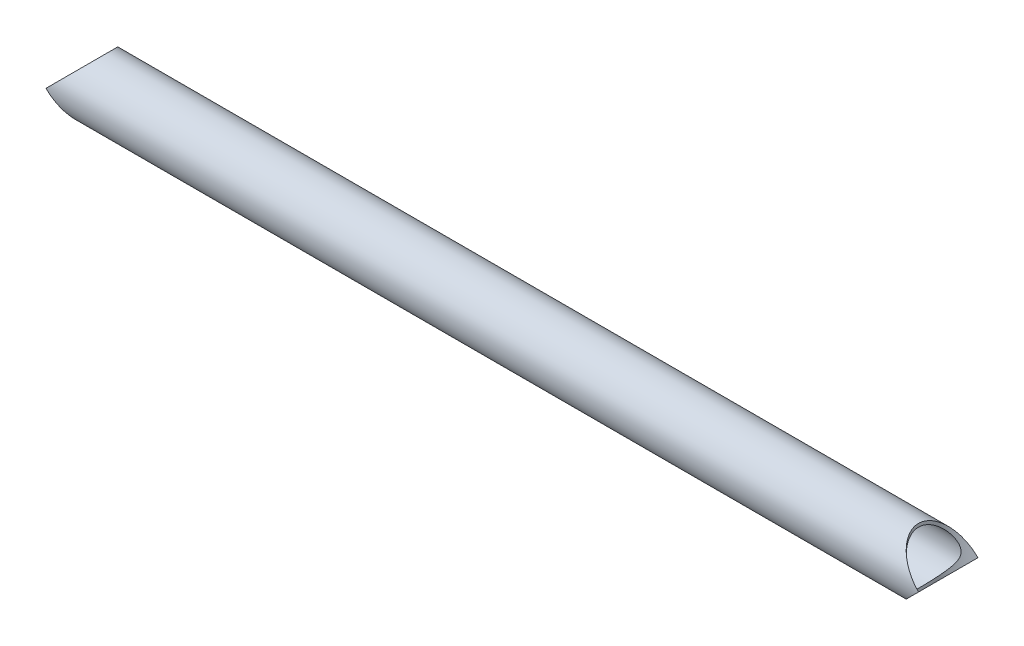
ISO-10303-21;
HEADER;
FILE_DESCRIPTION(('STEP AP214'),'2;1');
FILE_NAME('part.step','',(''),(''),'','','');
FILE_SCHEMA(('AUTOMOTIVE_DESIGN { 1 0 10303 214 1 1 1 1 }'));
ENDSEC;
DATA;
#1=APPLICATION_CONTEXT('core data for automotive mechanical design processes');
#2=APPLICATION_PROTOCOL_DEFINITION('international standard','automotive_design',2000,#1);
#3=PRODUCT_CONTEXT('',#1,'mechanical');
#4=PRODUCT('Part','Part','',(#3));
#5=PRODUCT_RELATED_PRODUCT_CATEGORY('part','',(#4));
#6=PRODUCT_DEFINITION_FORMATION('','',#4);
#7=PRODUCT_DEFINITION_CONTEXT('part definition',#1,'design');
#8=PRODUCT_DEFINITION('design','',#6,#7);
#9=PRODUCT_DEFINITION_SHAPE('','',#8);
#10=(LENGTH_UNIT() NAMED_UNIT(*) SI_UNIT(.MILLI.,.METRE.));
#11=(NAMED_UNIT(*) PLANE_ANGLE_UNIT() SI_UNIT($,.RADIAN.));
#12=(NAMED_UNIT(*) SI_UNIT($,.STERADIAN.) SOLID_ANGLE_UNIT());
#13=UNCERTAINTY_MEASURE_WITH_UNIT(LENGTH_MEASURE(1.E-05),#10,'distance_accuracy_value','');
#14=(GEOMETRIC_REPRESENTATION_CONTEXT(3) GLOBAL_UNCERTAINTY_ASSIGNED_CONTEXT((#13)) GLOBAL_UNIT_ASSIGNED_CONTEXT((#10,
#11,#12)) REPRESENTATION_CONTEXT('',''));
#15=CARTESIAN_POINT('',(0.,0.,0.));
#16=DIRECTION('',(0.,0.,1.));
#17=DIRECTION('',(1.,0.,0.));
#18=AXIS2_PLACEMENT_3D('',#15,#16,#17);
#19=CARTESIAN_POINT('',(-279.4,0.,0.));
#20=DIRECTION('',(1.,0.,0.));
#21=DIRECTION('',(0.,0.,-1.));
#22=AXIS2_PLACEMENT_3D('',#19,#20,#21);
#23=CYLINDRICAL_SURFACE('',#22,16.9418);
#24=CARTESIAN_POINT('',(260.35,16.9418,0.));
#25=CARTESIAN_POINT('',(260.35000374405,16.9417961923884,0.394184193497354));
#26=CARTESIAN_POINT('',(260.362262153139,16.9280155894072,0.788435535775757));
#27=CARTESIAN_POINT('',(260.411024211929,16.8731574498692,1.57356577010718));
#28=CARTESIAN_POINT('',(260.447533436322,16.8320736369451,1.96444386579684));
#29=CARTESIAN_POINT('',(260.544014592432,16.7233639167852,2.73991152674503));
#30=CARTESIAN_POINT('',(260.604008108813,16.6557135918004,3.12449496676739));
#31=CARTESIAN_POINT('',(260.746166269736,16.4951203047581,3.88411123711812));
#32=CARTESIAN_POINT('',(260.828330169879,16.4021781919052,4.25914438764759));
#33=CARTESIAN_POINT('',(261.012598152288,16.1932406328883,4.99488319536369));
#34=CARTESIAN_POINT('',(261.114569298355,16.0773987911132,5.35566607021391));
#35=CARTESIAN_POINT('',(261.33697357334,15.8239912188579,6.06360117385423));
#36=CARTESIAN_POINT('',(261.457406460062,15.6864257733653,6.41075358138511));
#37=CARTESIAN_POINT('',(261.714834278465,15.3913086823074,7.09008972801091));
#38=CARTESIAN_POINT('',(261.851830369669,15.2337556374548,7.42227241690055));
#39=CARTESIAN_POINT('',(262.140464241844,14.900356318422,8.07074683742287));
#40=CARTESIAN_POINT('',(262.292105284975,14.7245059678419,8.38703500458891));
#41=CARTESIAN_POINT('',(262.670217204701,14.2837373054012,9.12410505100004));
#42=CARTESIAN_POINT('',(262.902687093087,14.0109622384892,9.53714057189234));
#43=CARTESIAN_POINT('',(263.387460743635,13.4367851491423,10.3304086586787));
#44=CARTESIAN_POINT('',(263.639771716018,13.1353727115659,10.7106291933897));
#45=CARTESIAN_POINT('',(264.160097116028,12.5063214936942,11.4389050770027));
#46=CARTESIAN_POINT('',(264.428144951756,12.1786263348985,11.7868876327892));
#47=CARTESIAN_POINT('',(264.974845762738,11.499897771744,12.4499819069018));
#48=CARTESIAN_POINT('',(265.253497327648,11.1488674664611,12.7650979759111));
#49=CARTESIAN_POINT('',(265.823194169387,10.4166191913228,13.3697111612045));
#50=CARTESIAN_POINT('',(266.114377220476,10.034898304148,13.6584684285955));
#51=CARTESIAN_POINT('',(266.697673625015,9.24882151979437,14.2025527079429));
#52=CARTESIAN_POINT('',(266.989787225436,8.84445904128633,14.4578699269681));
#53=CARTESIAN_POINT('',(267.567840094133,8.01320927376596,14.9346013590283));
#54=CARTESIAN_POINT('',(267.853789755916,7.58636490171244,15.1560772296062));
#55=CARTESIAN_POINT('',(268.271695004004,6.92746866843015,15.4626419512512));
#56=CARTESIAN_POINT('',(268.409134561576,6.70477675080935,15.5605388024915));
#57=CARTESIAN_POINT('',(268.678904063937,6.25275448249375,15.7476188132693));
#58=CARTESIAN_POINT('',(268.811234784508,6.02342514902508,15.8368032989616));
#59=CARTESIAN_POINT('',(269.070396494113,5.5552838813426,16.0070634993151));
#60=CARTESIAN_POINT('',(269.197156460578,5.31639841182006,16.088045825461));
#61=CARTESIAN_POINT('',(269.441456023067,4.83100990439236,16.2404006796485));
#62=CARTESIAN_POINT('',(269.558997959897,4.58450882268691,16.3117756506805));
#63=CARTESIAN_POINT('',(269.782080889626,4.0837067582187,16.4442984069774));
#64=CARTESIAN_POINT('',(269.887633328698,3.82941351414151,16.5054559733479));
#65=CARTESIAN_POINT('',(270.083627012263,3.31270004661861,16.6168712827558));
#66=CARTESIAN_POINT('',(270.174070755538,3.05028117557337,16.6671308285956));
#67=CARTESIAN_POINT('',(270.322853996104,2.56155126793314,16.7485490492217));
#68=CARTESIAN_POINT('',(270.384027358225,2.33640475862086,16.7814899418482));
#69=CARTESIAN_POINT('',(270.491080238411,1.8814284085682,16.8385670532647));
#70=CARTESIAN_POINT('',(270.536964442065,1.65160002561208,16.8627059697651));
#71=CARTESIAN_POINT('',(270.61142642816,1.18876159210726,16.9016346143041));
#72=CARTESIAN_POINT('',(270.640035117052,0.955757990655739,16.9164410405595));
#73=CARTESIAN_POINT('',(270.678675593239,0.487787683136439,16.9363952490215));
#74=CARTESIAN_POINT('',(270.688708023371,0.252821045282712,16.9415433654564));
#75=CARTESIAN_POINT('',(270.689671046546,-0.217818078177454,16.9420385610885));
#76=CARTESIAN_POINT('',(270.680548328064,-0.453490706010506,16.9373582864601));
#77=CARTESIAN_POINT('',(270.643575971063,-0.922946866189646,16.9182729817827));
#78=CARTESIAN_POINT('',(270.615725790753,-1.15673034368407,16.9038676703857));
#79=CARTESIAN_POINT('',(270.54261073801,-1.62115360877379,16.8656705247631));
#80=CARTESIAN_POINT('',(270.497316267991,-1.85178735983582,16.8418627356726));
#81=CARTESIAN_POINT('',(270.391268999413,-2.30839613187293,16.7853765549414));
#82=CARTESIAN_POINT('',(270.330510348983,-2.53436935416419,16.7526948049513));
#83=CARTESIAN_POINT('',(270.161317887817,-3.09495879054535,16.6602122327194));
#84=CARTESIAN_POINT('',(270.044381527947,-3.42613532293252,16.5950848859265));
#85=CARTESIAN_POINT('',(269.787584269334,-4.07550920863544,16.4476704242981));
#86=CARTESIAN_POINT('',(269.647709104086,-4.39369832980277,16.3653726217851));
#87=CARTESIAN_POINT('',(269.350719694187,-5.01855813637689,16.1847084588516));
#88=CARTESIAN_POINT('',(269.193546861256,-5.3251846390518,16.0862869000012));
#89=CARTESIAN_POINT('',(268.867258231689,-5.92659541327603,15.8745609394275));
#90=CARTESIAN_POINT('',(268.698143533768,-6.22138077036855,15.7612579060561));
#91=CARTESIAN_POINT('',(268.373468669035,-6.76368935777242,15.5355128442468));
#92=CARTESIAN_POINT('',(268.218874817248,-7.01249751499675,15.4247509464399));
#93=CARTESIAN_POINT('',(267.905349492994,-7.50229328838962,15.1925513006733));
#94=CARTESIAN_POINT('',(267.746417447248,-7.74327986165941,15.0711121369911));
#95=CARTESIAN_POINT('',(267.265443368151,-8.45533714282097,14.6908757746472));
#96=CARTESIAN_POINT('',(266.939334858791,-8.91532399132135,14.4162357153203));
#97=CARTESIAN_POINT('',(266.286691494802,-9.80676129687197,13.8252563067096));
#98=CARTESIAN_POINT('',(265.960156916591,-10.2382252174247,13.508936845222));
#99=CARTESIAN_POINT('',(265.31432323517,-11.0723963580602,12.8341031687215));
#100=CARTESIAN_POINT('',(264.995021008555,-11.4751161598644,12.4756075990565));
#101=CARTESIAN_POINT('',(264.429484484933,-12.1767333021638,11.7875104078084));
#102=CARTESIAN_POINT('',(264.180835679443,-12.4808781654303,11.4652302076634));
#103=CARTESIAN_POINT('',(263.696387585142,-13.0672425088248,10.7921703362535));
#104=CARTESIAN_POINT('',(263.460588584201,-13.3494614978141,10.4413900269469));
#105=CARTESIAN_POINT('',(263.005918358068,-13.8891714046938,9.71190317795474));
#106=CARTESIAN_POINT('',(262.787023484663,-14.146696994291,9.33323715426072));
#107=CARTESIAN_POINT('',(262.369721476738,-14.6344940609238,8.54807684872159));
#108=CARTESIAN_POINT('',(262.171308974995,-14.8647726801095,8.14158990376797));
#109=CARTESIAN_POINT('',(261.838182123013,-15.2494827529787,7.39030570283803));
#110=CARTESIAN_POINT('',(261.698845147345,-15.4096825772221,7.05050184258115));
#111=CARTESIAN_POINT('',(261.437548692147,-15.7091405581432,6.35536238395083));
#112=CARTESIAN_POINT('',(261.315585484047,-15.8484032084881,6.00003013956726));
#113=CARTESIAN_POINT('',(261.091184083557,-16.1039921676819,5.27573053950247));
#114=CARTESIAN_POINT('',(260.988722110629,-16.2203464179418,4.9067804543204));
#115=CARTESIAN_POINT('',(260.805060307867,-16.4285201572901,4.15687556096405));
#116=CARTESIAN_POINT('',(260.723855421012,-16.5203454818711,3.77592363221097));
#117=CARTESIAN_POINT('',(260.604213596944,-16.6554600945729,3.11441535552881));
#118=CARTESIAN_POINT('',(260.560182409363,-16.7051249938061,2.83614726285123));
#119=CARTESIAN_POINT('',(260.484322860884,-16.7906319202838,2.27585994761371));
#120=CARTESIAN_POINT('',(260.452493065463,-16.8264755725,1.99384117005954));
#121=CARTESIAN_POINT('',(260.40140252241,-16.8839855488843,1.4271469838388));
#122=CARTESIAN_POINT('',(260.382145187254,-16.9056480239346,1.14247087515575));
#123=CARTESIAN_POINT('',(260.356443660979,-16.9345554007589,0.571874809772045));
#124=CARTESIAN_POINT('',(260.349997283934,-16.9418027621753,0.28595507361625));
#125=CARTESIAN_POINT('',(260.35000374405,-16.9417961923884,-0.394184193497359));
#126=CARTESIAN_POINT('',(260.362262153139,-16.9280155894072,-0.788435535775761));
#127=CARTESIAN_POINT('',(260.411024211929,-16.8731574498692,-1.57356577010718));
#128=CARTESIAN_POINT('',(260.447533436322,-16.8320736369451,-1.96444386579685));
#129=CARTESIAN_POINT('',(260.544014592432,-16.7233639167852,-2.73991152674503));
#130=CARTESIAN_POINT('',(260.604008108813,-16.6557135918004,-3.1244949667674));
#131=CARTESIAN_POINT('',(260.746166269736,-16.4951203047581,-3.88411123711813));
#132=CARTESIAN_POINT('',(260.828330169879,-16.4021781919052,-4.25914438764759));
#133=CARTESIAN_POINT('',(261.012598152288,-16.1932406328883,-4.9948831953637));
#134=CARTESIAN_POINT('',(261.114569298355,-16.0773987911132,-5.35566607021392));
#135=CARTESIAN_POINT('',(261.33697357334,-15.8239912188579,-6.06360117385424));
#136=CARTESIAN_POINT('',(261.457406460062,-15.6864257733653,-6.41075358138512));
#137=CARTESIAN_POINT('',(261.714834278465,-15.3913086823074,-7.09008972801092));
#138=CARTESIAN_POINT('',(261.851830369669,-15.2337556374548,-7.42227241690056));
#139=CARTESIAN_POINT('',(262.140464241844,-14.9003563184219,-8.07074683742288));
#140=CARTESIAN_POINT('',(262.292105284975,-14.7245059678419,-8.38703500458892));
#141=CARTESIAN_POINT('',(262.670217204701,-14.2837373054012,-9.12410505100005));
#142=CARTESIAN_POINT('',(262.902687093087,-14.0109622384892,-9.53714057189236));
#143=CARTESIAN_POINT('',(263.387460743635,-13.4367851491422,-10.3304086586787));
#144=CARTESIAN_POINT('',(263.639771716018,-13.1353727115659,-10.7106291933897));
#145=CARTESIAN_POINT('',(264.160097116028,-12.5063214936942,-11.4389050770027));
#146=CARTESIAN_POINT('',(264.428144951756,-12.1786263348985,-11.7868876327893));
#147=CARTESIAN_POINT('',(264.974845762738,-11.499897771744,-12.4499819069018));
#148=CARTESIAN_POINT('',(265.253497327648,-11.1488674664611,-12.7650979759111));
#149=CARTESIAN_POINT('',(265.823194169387,-10.4166191913228,-13.3697111612045));
#150=CARTESIAN_POINT('',(266.114377220476,-10.034898304148,-13.6584684285955));
#151=CARTESIAN_POINT('',(266.697673625015,-9.24882151979437,-14.2025527079429));
#152=CARTESIAN_POINT('',(266.989787225436,-8.84445904128633,-14.4578699269681));
#153=CARTESIAN_POINT('',(267.567840094133,-8.01320927376595,-14.9346013590283));
#154=CARTESIAN_POINT('',(267.853789755916,-7.58636490171244,-15.1560772296062));
#155=CARTESIAN_POINT('',(268.271695004004,-6.92746866843014,-15.4626419512512));
#156=CARTESIAN_POINT('',(268.409134561576,-6.70477675080934,-15.5605388024915));
#157=CARTESIAN_POINT('',(268.678904063937,-6.25275448249373,-15.7476188132693));
#158=CARTESIAN_POINT('',(268.811234784508,-6.02342514902506,-15.8368032989616));
#159=CARTESIAN_POINT('',(269.070396494113,-5.55528388134259,-16.0070634993152));
#160=CARTESIAN_POINT('',(269.197156460578,-5.31639841182005,-16.088045825461));
#161=CARTESIAN_POINT('',(269.441456023067,-4.83100990439235,-16.2404006796486));
#162=CARTESIAN_POINT('',(269.558997959897,-4.58450882268689,-16.3117756506805));
#163=CARTESIAN_POINT('',(269.782080889626,-4.08370675821868,-16.4442984069774));
#164=CARTESIAN_POINT('',(269.887633328698,-3.8294135141415,-16.5054559733479));
#165=CARTESIAN_POINT('',(270.083627012263,-3.31270004661861,-16.6168712827558));
#166=CARTESIAN_POINT('',(270.174070755538,-3.05028117557335,-16.6671308285956));
#167=CARTESIAN_POINT('',(270.322853996104,-2.56155126793312,-16.7485490492217));
#168=CARTESIAN_POINT('',(270.384027358225,-2.33640475862085,-16.7814899418482));
#169=CARTESIAN_POINT('',(270.491080238411,-1.88142840856819,-16.8385670532647));
#170=CARTESIAN_POINT('',(270.536964442065,-1.65160002561206,-16.8627059697651));
#171=CARTESIAN_POINT('',(270.61142642816,-1.18876159210724,-16.9016346143041));
#172=CARTESIAN_POINT('',(270.640035117052,-0.955757990655716,-16.9164410405595));
#173=CARTESIAN_POINT('',(270.678675593239,-0.487787683136415,-16.9363952490215));
#174=CARTESIAN_POINT('',(270.688708023371,-0.252821045282685,-16.9415433654564));
#175=CARTESIAN_POINT('',(270.689671046546,0.217818078177484,-16.9420385610885));
#176=CARTESIAN_POINT('',(270.680548328064,0.453490706010536,-16.9373582864601));
#177=CARTESIAN_POINT('',(270.643575971063,0.922946866189676,-16.9182729817827));
#178=CARTESIAN_POINT('',(270.615725790753,1.1567303436841,-16.9038676703857));
#179=CARTESIAN_POINT('',(270.54261073801,1.62115360877382,-16.8656705247631));
#180=CARTESIAN_POINT('',(270.497316267991,1.85178735983585,-16.8418627356726));
#181=CARTESIAN_POINT('',(270.391268999413,2.30839613187296,-16.7853765549414));
#182=CARTESIAN_POINT('',(270.330510348983,2.53436935416423,-16.7526948049513));
#183=CARTESIAN_POINT('',(270.161317887817,3.0949587905454,-16.6602122327194));
#184=CARTESIAN_POINT('',(270.044381527947,3.42613532293257,-16.5950848859265));
#185=CARTESIAN_POINT('',(269.787584269334,4.07550920863552,-16.4476704242981));
#186=CARTESIAN_POINT('',(269.647709104086,4.39369832980287,-16.3653726217851));
#187=CARTESIAN_POINT('',(269.350719694186,5.01855813637699,-16.1847084588515));
#188=CARTESIAN_POINT('',(269.193546861256,5.32518463905188,-16.0862869000011));
#189=CARTESIAN_POINT('',(268.867258231689,5.92659541327609,-15.8745609394275));
#190=CARTESIAN_POINT('',(268.698143533768,6.22138077036862,-15.7612579060561));
#191=CARTESIAN_POINT('',(268.373468669035,6.76368935777248,-15.5355128442468));
#192=CARTESIAN_POINT('',(268.218874817248,7.0124975149968,-15.4247509464399));
#193=CARTESIAN_POINT('',(267.905349492994,7.50229328838967,-15.1925513006733));
#194=CARTESIAN_POINT('',(267.746417447248,7.74327986165946,-15.0711121369911));
#195=CARTESIAN_POINT('',(267.26544336815,8.45533714282102,-14.6908757746471));
#196=CARTESIAN_POINT('',(266.939334858791,8.9153239913214,-14.4162357153203));
#197=CARTESIAN_POINT('',(266.286691494802,9.806761296872,-13.8252563067096));
#198=CARTESIAN_POINT('',(265.960156916591,10.2382252174247,-13.5089368452219));
#199=CARTESIAN_POINT('',(265.31432323517,11.0723963580602,-12.8341031687215));
#200=CARTESIAN_POINT('',(264.995021008555,11.4751161598644,-12.4756075990565));
#201=CARTESIAN_POINT('',(264.429484484933,12.1767333021638,-11.7875104078084));
#202=CARTESIAN_POINT('',(264.180835679443,12.4808781654303,-11.4652302076634));
#203=CARTESIAN_POINT('',(263.696387585142,13.0672425088248,-10.7921703362535));
#204=CARTESIAN_POINT('',(263.460588584201,13.3494614978141,-10.4413900269469));
#205=CARTESIAN_POINT('',(263.005918358068,13.8891714046938,-9.71190317795473));
#206=CARTESIAN_POINT('',(262.787023484663,14.146696994291,-9.33323715426072));
#207=CARTESIAN_POINT('',(262.369721476738,14.6344940609238,-8.54807684872159));
#208=CARTESIAN_POINT('',(262.171308974995,14.8647726801095,-8.14158990376797));
#209=CARTESIAN_POINT('',(261.838182123013,15.2494827529787,-7.39030570283803));
#210=CARTESIAN_POINT('',(261.698845147345,15.4096825772221,-7.05050184258115));
#211=CARTESIAN_POINT('',(261.437548692147,15.7091405581432,-6.35536238395083));
#212=CARTESIAN_POINT('',(261.315585484047,15.8484032084881,-6.00003013956726));
#213=CARTESIAN_POINT('',(261.091184083557,16.1039921676819,-5.27573053950248));
#214=CARTESIAN_POINT('',(260.988722110629,16.2203464179418,-4.9067804543204));
#215=CARTESIAN_POINT('',(260.805060307867,16.4285201572901,-4.15687556096405));
#216=CARTESIAN_POINT('',(260.723855421012,16.5203454818711,-3.77592363221097));
#217=CARTESIAN_POINT('',(260.604213596944,16.6554600945729,-3.11441535552881));
#218=CARTESIAN_POINT('',(260.560182409363,16.7051249938061,-2.83614726285123));
#219=CARTESIAN_POINT('',(260.484322860884,16.7906319202838,-2.2758599476137));
#220=CARTESIAN_POINT('',(260.452493065463,16.8264755725,-1.99384117005953));
#221=CARTESIAN_POINT('',(260.40140252241,16.8839855488843,-1.4271469838388));
#222=CARTESIAN_POINT('',(260.382145187254,16.9056480239346,-1.14247087515576));
#223=CARTESIAN_POINT('',(260.356443660979,16.9345554007589,-0.571874809772051));
#224=CARTESIAN_POINT('',(260.349997283934,16.9418027621753,-0.285955073616256));
#225=CARTESIAN_POINT('',(260.35,16.9418,0.));
#226=B_SPLINE_CURVE_WITH_KNOTS('',3,(#24,#25,#26,#27,#28,#29,#30,#31,#32,#33,#34,#35,#36,#37,
#38,#39,#40,#41,#42,#43,#44,#45,#46,#47,#48,#49,#50,#51,#52,#53,#54,#55,#56,#57,#58,#59,#60,#61,
#62,#63,#64,#65,#66,#67,#68,#69,#70,#71,#72,#73,#74,#75,#76,#77,#78,#79,#80,#81,#82,#83,#84,#85,
#86,#87,#88,#89,#90,#91,#92,#93,#94,#95,#96,#97,#98,#99,#100,#101,#102,#103,#104,#105,#106,#107,
#108,#109,#110,#111,#112,#113,#114,#115,#116,#117,#118,#119,#120,#121,#122,#123,#124,#125,#126,
#127,#128,#129,#130,#131,#132,#133,#134,#135,#136,#137,#138,#139,#140,#141,#142,#143,#144,#145,
#146,#147,#148,#149,#150,#151,#152,#153,#154,#155,#156,#157,#158,#159,#160,#161,#162,#163,#164,
#165,#166,#167,#168,#169,#170,#171,#172,#173,#174,#175,#176,#177,#178,#179,#180,#181,#182,#183,
#184,#185,#186,#187,#188,#189,#190,#191,#192,#193,#194,#195,#196,#197,#198,#199,#200,#201,#202,
#203,#204,#205,#206,#207,#208,#209,#210,#211,#212,#213,#214,#215,#216,#217,#218,#219,#220,#221,
#222,#223,#224,#225),.UNSPECIFIED.,.T.,.F.,(4,2,2,2,2,2,2,2,2,2,2,2,2,2,2,2,2,2,2,2,2,2,2,2,2,2,
2,2,2,2,2,2,2,2,2,2,2,2,2,2,2,2,2,2,2,2,2,2,2,2,2,2,2,2,2,2,2,2,2,2,2,2,2,2,2,2,2,2,2,2,2,2,2,2,
2,2,2,2,2,2,2,2,2,2,2,2,2,2,2,2,2,2,2,2,2,2,2,2,2,2,4),(0.,1.182242256413,2.36475637661828,
3.54835991978546,4.73192372682959,5.90780261774796,7.08366608382876,8.25961191496233,
9.43582029464445,11.0739682017032,12.7127141850546,14.3550745833379,15.997217298389,
17.6764688085164,19.3562109937498,21.0328552979582,21.8708516620749,22.7087202709684,
23.5552531660917,24.4015703937179,25.2470727422877,26.092435116949,26.7986824529679,
27.5047131495125,28.2094769630755,28.9142163876493,29.6209198025279,30.3276436634078,
31.0355719374648,31.7437685012011,32.8135631624544,33.8840257101522,34.9582325707477,
36.0323407270625,36.9715067853864,37.9107975581713,39.7900551537561,41.6684192659187,
43.5459560833924,45.0690515735913,46.592181171246,48.1131398453261,49.6336989485931,
50.8346318927197,52.0353067160249,53.234507876433,54.4334234892966,55.2910781673585,
56.148631979721,57.0064184567369,57.8640585575876,59.0463008140006,60.2288149342059,
61.4124184773731,62.5959822844172,63.7718611753356,64.9477246414164,66.12367047255,
67.2998788522321,68.9380267592908,70.5767727426422,72.2191331409255,73.8612758559766,
75.540527366104,77.2202695513374,78.8969138555458,79.7349102196626,80.572778828556,
81.4193117236794,82.2656289513056,83.1111312998754,83.9564936745367,84.6627410105555,
85.3687717071002,86.0735355206631,86.7782749452369,87.4849783601155,88.1917022209954,
88.8996304950525,89.6078270587888,90.6776217200421,91.74808426774,92.8222911283355,
93.8963992846502,94.8355653429742,95.7748561157591,97.6541137113438,99.5324778235064,
101.41001464098,102.933110131179,104.456239728834,105.977198402914,107.497757506181,
108.698690450307,109.899365273613,111.098566434021,112.297482046884,113.155136724946,
114.012690537309,114.870477014325,115.728117115175),.UNSPECIFIED.);
#227=CARTESIAN_POINT('',(260.35,16.9418,0.));
#228=VERTEX_POINT('',#227);
#229=EDGE_CURVE('E21',#228,#228,#226,.T.);
#230=ORIENTED_EDGE('',*,*,#229,.T.);
#231=EDGE_LOOP('',(#230));
#232=FACE_BOUND('',#231,.T.);
#233=CARTESIAN_POINT('',(-260.35,-16.9418,0.));
#234=CARTESIAN_POINT('',(-260.35000374405,-16.9417961923884,0.394184193497358));
#235=CARTESIAN_POINT('',(-260.362262153139,-16.9280155894072,0.788435535775761));
#236=CARTESIAN_POINT('',(-260.411024211929,-16.8731574498692,1.57356577010718));
#237=CARTESIAN_POINT('',(-260.447533436322,-16.8320736369451,1.96444386579685));
#238=CARTESIAN_POINT('',(-260.544014592432,-16.7233639167852,2.73991152674503));
#239=CARTESIAN_POINT('',(-260.604008108813,-16.6557135918004,3.1244949667674));
#240=CARTESIAN_POINT('',(-260.746166269736,-16.4951203047581,3.88411123711813));
#241=CARTESIAN_POINT('',(-260.828330169879,-16.4021781919052,4.25914438764759));
#242=CARTESIAN_POINT('',(-261.012598152288,-16.1932406328883,4.9948831953637));
#243=CARTESIAN_POINT('',(-261.114569298355,-16.0773987911132,5.35566607021392));
#244=CARTESIAN_POINT('',(-261.33697357334,-15.8239912188579,6.06360117385424));
#245=CARTESIAN_POINT('',(-261.457406460062,-15.6864257733653,6.41075358138512));
#246=CARTESIAN_POINT('',(-261.714834278465,-15.3913086823074,7.09008972801092));
#247=CARTESIAN_POINT('',(-261.851830369669,-15.2337556374548,7.42227241690056));
#248=CARTESIAN_POINT('',(-262.140464241844,-14.9003563184219,8.07074683742288));
#249=CARTESIAN_POINT('',(-262.292105284975,-14.7245059678419,8.38703500458892));
#250=CARTESIAN_POINT('',(-262.670217204701,-14.2837373054012,9.12410505100006));
#251=CARTESIAN_POINT('',(-262.902687093087,-14.0109622384892,9.53714057189236));
#252=CARTESIAN_POINT('',(-263.387460743635,-13.4367851491422,10.3304086586787));
#253=CARTESIAN_POINT('',(-263.639771716018,-13.1353727115659,10.7106291933897));
#254=CARTESIAN_POINT('',(-264.160097116028,-12.5063214936942,11.4389050770027));
#255=CARTESIAN_POINT('',(-264.428144951756,-12.1786263348985,11.7868876327893));
#256=CARTESIAN_POINT('',(-264.974845762738,-11.499897771744,12.4499819069018));
#257=CARTESIAN_POINT('',(-265.253497327648,-11.1488674664611,12.7650979759111));
#258=CARTESIAN_POINT('',(-265.823194169387,-10.4166191913228,13.3697111612045));
#259=CARTESIAN_POINT('',(-266.114377220476,-10.034898304148,13.6584684285955));
#260=CARTESIAN_POINT('',(-266.697673625015,-9.24882151979437,14.2025527079429));
#261=CARTESIAN_POINT('',(-266.989787225436,-8.84445904128633,14.4578699269681));
#262=CARTESIAN_POINT('',(-267.567840094133,-8.01320927376595,14.9346013590283));
#263=CARTESIAN_POINT('',(-267.853789755916,-7.58636490171244,15.1560772296062));
#264=CARTESIAN_POINT('',(-268.271695004004,-6.92746866843014,15.4626419512512));
#265=CARTESIAN_POINT('',(-268.409134561576,-6.70477675080934,15.5605388024915));
#266=CARTESIAN_POINT('',(-268.678904063937,-6.25275448249374,15.7476188132693));
#267=CARTESIAN_POINT('',(-268.811234784508,-6.02342514902508,15.8368032989616));
#268=CARTESIAN_POINT('',(-269.070396494113,-5.5552838813426,16.0070634993151));
#269=CARTESIAN_POINT('',(-269.197156460578,-5.31639841182005,16.088045825461));
#270=CARTESIAN_POINT('',(-269.441456023067,-4.83100990439236,16.2404006796485));
#271=CARTESIAN_POINT('',(-269.558997959897,-4.58450882268691,16.3117756506805));
#272=CARTESIAN_POINT('',(-269.782080889626,-4.0837067582187,16.4442984069774));
#273=CARTESIAN_POINT('',(-269.887633328698,-3.82941351414151,16.5054559733479));
#274=CARTESIAN_POINT('',(-270.083627012263,-3.31270004661861,16.6168712827558));
#275=CARTESIAN_POINT('',(-270.174070755538,-3.05028117557336,16.6671308285956));
#276=CARTESIAN_POINT('',(-270.322853996104,-2.56155126793314,16.7485490492217));
#277=CARTESIAN_POINT('',(-270.384027358225,-2.33640475862086,16.7814899418482));
#278=CARTESIAN_POINT('',(-270.491080238411,-1.8814284085682,16.8385670532647));
#279=CARTESIAN_POINT('',(-270.536964442065,-1.65160002561208,16.8627059697651));
#280=CARTESIAN_POINT('',(-270.61142642816,-1.18876159210725,16.9016346143041));
#281=CARTESIAN_POINT('',(-270.640035117052,-0.955757990655727,16.9164410405595));
#282=CARTESIAN_POINT('',(-270.678675593239,-0.487787683136425,16.9363952490215));
#283=CARTESIAN_POINT('',(-270.688708023371,-0.252821045282697,16.9415433654564));
#284=CARTESIAN_POINT('',(-270.689671046546,0.21781807817747,16.9420385610885));
#285=CARTESIAN_POINT('',(-270.680548328064,0.453490706010523,16.9373582864601));
#286=CARTESIAN_POINT('',(-270.643575971063,0.922946866189663,16.9182729817827));
#287=CARTESIAN_POINT('',(-270.615725790753,1.15673034368409,16.9038676703857));
#288=CARTESIAN_POINT('',(-270.54261073801,1.62115360877381,16.8656705247631));
#289=CARTESIAN_POINT('',(-270.497316267991,1.85178735983584,16.8418627356726));
#290=CARTESIAN_POINT('',(-270.391268999413,2.30839613187295,16.7853765549414));
#291=CARTESIAN_POINT('',(-270.330510348983,2.53436935416422,16.7526948049513));
#292=CARTESIAN_POINT('',(-270.161317887817,3.09495879054539,16.6602122327194));
#293=CARTESIAN_POINT('',(-270.044381527947,3.42613532293256,16.5950848859265));
#294=CARTESIAN_POINT('',(-269.787584269334,4.07550920863552,16.4476704242981));
#295=CARTESIAN_POINT('',(-269.647709104086,4.39369832980286,16.3653726217851));
#296=CARTESIAN_POINT('',(-269.350719694186,5.01855813637698,16.1847084588515));
#297=CARTESIAN_POINT('',(-269.193546861256,5.32518463905187,16.0862869000011));
#298=CARTESIAN_POINT('',(-268.867258231689,5.92659541327609,15.8745609394275));
#299=CARTESIAN_POINT('',(-268.698143533768,6.22138077036862,15.7612579060561));
#300=CARTESIAN_POINT('',(-268.373468669035,6.76368935777248,15.5355128442468));
#301=CARTESIAN_POINT('',(-268.218874817248,7.0124975149968,15.4247509464399));
#302=CARTESIAN_POINT('',(-267.905349492994,7.50229328838967,15.1925513006733));
#303=CARTESIAN_POINT('',(-267.746417447248,7.74327986165946,15.0711121369911));
#304=CARTESIAN_POINT('',(-267.26544336815,8.45533714282101,14.6908757746472));
#305=CARTESIAN_POINT('',(-266.939334858791,8.91532399132138,14.4162357153203));
#306=CARTESIAN_POINT('',(-266.286691494802,9.80676129687198,13.8252563067096));
#307=CARTESIAN_POINT('',(-265.960156916591,10.2382252174247,13.5089368452219));
#308=CARTESIAN_POINT('',(-265.31432323517,11.0723963580602,12.8341031687215));
#309=CARTESIAN_POINT('',(-264.995021008555,11.4751161598644,12.4756075990565));
#310=CARTESIAN_POINT('',(-264.429484484933,12.1767333021638,11.7875104078084));
#311=CARTESIAN_POINT('',(-264.180835679443,12.4808781654303,11.4652302076634));
#312=CARTESIAN_POINT('',(-263.696387585142,13.0672425088248,10.7921703362535));
#313=CARTESIAN_POINT('',(-263.460588584201,13.3494614978141,10.4413900269469));
#314=CARTESIAN_POINT('',(-263.005918358068,13.8891714046938,9.71190317795473));
#315=CARTESIAN_POINT('',(-262.787023484663,14.146696994291,9.33323715426072));
#316=CARTESIAN_POINT('',(-262.369721476738,14.6344940609238,8.54807684872159));
#317=CARTESIAN_POINT('',(-262.171308974995,14.8647726801095,8.14158990376796));
#318=CARTESIAN_POINT('',(-261.838182123013,15.2494827529787,7.39030570283802));
#319=CARTESIAN_POINT('',(-261.698845147345,15.4096825772221,7.05050184258114));
#320=CARTESIAN_POINT('',(-261.437548692147,15.7091405581433,6.35536238395082));
#321=CARTESIAN_POINT('',(-261.315585484047,15.8484032084881,6.00003013956724));
#322=CARTESIAN_POINT('',(-261.091184083557,16.1039921676819,5.27573053950245));
#323=CARTESIAN_POINT('',(-260.988722110629,16.2203464179418,4.90678045432038));
#324=CARTESIAN_POINT('',(-260.805060307867,16.4285201572901,4.15687556096404));
#325=CARTESIAN_POINT('',(-260.723855421012,16.5203454818711,3.77592363221096));
#326=CARTESIAN_POINT('',(-260.604213596944,16.6554600945729,3.11441535552881));
#327=CARTESIAN_POINT('',(-260.560182409363,16.7051249938061,2.83614726285122));
#328=CARTESIAN_POINT('',(-260.484322860884,16.7906319202838,2.27585994761369));
#329=CARTESIAN_POINT('',(-260.452493065463,16.8264755725,1.99384117005952));
#330=CARTESIAN_POINT('',(-260.40140252241,16.8839855488843,1.42714698383879));
#331=CARTESIAN_POINT('',(-260.382145187254,16.9056480239346,1.14247087515574));
#332=CARTESIAN_POINT('',(-260.356443660979,16.9345554007589,0.571874809772038));
#333=CARTESIAN_POINT('',(-260.349997283934,16.9418027621753,0.285955073616246));
#334=CARTESIAN_POINT('',(-260.35000374405,16.9417961923884,-0.39418419349736));
#335=CARTESIAN_POINT('',(-260.362262153139,16.9280155894072,-0.788435535775761));
#336=CARTESIAN_POINT('',(-260.411024211929,16.8731574498691,-1.57356577010718));
#337=CARTESIAN_POINT('',(-260.447533436322,16.8320736369451,-1.96444386579685));
#338=CARTESIAN_POINT('',(-260.544014592432,16.7233639167852,-2.73991152674503));
#339=CARTESIAN_POINT('',(-260.604008108813,16.6557135918004,-3.1244949667674));
#340=CARTESIAN_POINT('',(-260.746166269736,16.4951203047581,-3.88411123711813));
#341=CARTESIAN_POINT('',(-260.828330169879,16.4021781919052,-4.25914438764759));
#342=CARTESIAN_POINT('',(-261.012598152288,16.1932406328883,-4.9948831953637));
#343=CARTESIAN_POINT('',(-261.114569298355,16.0773987911132,-5.35566607021392));
#344=CARTESIAN_POINT('',(-261.33697357334,15.8239912188579,-6.06360117385424));
#345=CARTESIAN_POINT('',(-261.457406460062,15.6864257733653,-6.41075358138512));
#346=CARTESIAN_POINT('',(-261.714834278466,15.3913086823074,-7.09008972801093));
#347=CARTESIAN_POINT('',(-261.851830369669,15.2337556374548,-7.42227241690058));
#348=CARTESIAN_POINT('',(-262.140464241844,14.9003563184219,-8.0707468374229));
#349=CARTESIAN_POINT('',(-262.292105284975,14.7245059678419,-8.38703500458892));
#350=CARTESIAN_POINT('',(-262.670217204701,14.2837373054012,-9.12410505100005));
#351=CARTESIAN_POINT('',(-262.902687093087,14.0109622384892,-9.53714057189236));
#352=CARTESIAN_POINT('',(-263.387460743635,13.4367851491422,-10.3304086586787));
#353=CARTESIAN_POINT('',(-263.639771716018,13.1353727115659,-10.7106291933897));
#354=CARTESIAN_POINT('',(-264.160097116028,12.5063214936942,-11.4389050770027));
#355=CARTESIAN_POINT('',(-264.428144951756,12.1786263348985,-11.7868876327893));
#356=CARTESIAN_POINT('',(-264.974845762738,11.499897771744,-12.4499819069018));
#357=CARTESIAN_POINT('',(-265.253497327648,11.1488674664611,-12.7650979759111));
#358=CARTESIAN_POINT('',(-265.823194169387,10.4166191913228,-13.3697111612045));
#359=CARTESIAN_POINT('',(-266.114377220476,10.034898304148,-13.6584684285955));
#360=CARTESIAN_POINT('',(-266.697673625015,9.24882151979437,-14.2025527079429));
#361=CARTESIAN_POINT('',(-266.989787225436,8.84445904128633,-14.4578699269681));
#362=CARTESIAN_POINT('',(-267.567840094133,8.01320927376595,-14.9346013590283));
#363=CARTESIAN_POINT('',(-267.853789755916,7.58636490171244,-15.1560772296062));
#364=CARTESIAN_POINT('',(-268.271695004004,6.92746866843014,-15.4626419512512));
#365=CARTESIAN_POINT('',(-268.409134561576,6.70477675080934,-15.5605388024915));
#366=CARTESIAN_POINT('',(-268.678904063937,6.25275448249374,-15.7476188132693));
#367=CARTESIAN_POINT('',(-268.811234784508,6.02342514902507,-15.8368032989616));
#368=CARTESIAN_POINT('',(-269.070396494113,5.55528388134259,-16.0070634993151));
#369=CARTESIAN_POINT('',(-269.197156460578,5.31639841182005,-16.088045825461));
#370=CARTESIAN_POINT('',(-269.441456023067,4.83100990439235,-16.2404006796486));
#371=CARTESIAN_POINT('',(-269.558997959897,4.58450882268689,-16.3117756506805));
#372=CARTESIAN_POINT('',(-269.782080889626,4.08370675821868,-16.4442984069774));
#373=CARTESIAN_POINT('',(-269.887633328698,3.82941351414151,-16.5054559733479));
#374=CARTESIAN_POINT('',(-270.083627012263,3.31270004661861,-16.6168712827558));
#375=CARTESIAN_POINT('',(-270.174070755538,3.05028117557335,-16.6671308285956));
#376=CARTESIAN_POINT('',(-270.322853996104,2.56155126793312,-16.7485490492217));
#377=CARTESIAN_POINT('',(-270.384027358225,2.33640475862085,-16.7814899418482));
#378=CARTESIAN_POINT('',(-270.491080238411,1.88142840856819,-16.8385670532647));
#379=CARTESIAN_POINT('',(-270.536964442065,1.65160002561206,-16.8627059697651));
#380=CARTESIAN_POINT('',(-270.61142642816,1.18876159210724,-16.9016346143041));
#381=CARTESIAN_POINT('',(-270.640035117052,0.955757990655717,-16.9164410405595));
#382=CARTESIAN_POINT('',(-270.678675593239,0.487787683136415,-16.9363952490215));
#383=CARTESIAN_POINT('',(-270.688708023371,0.252821045282685,-16.9415433654564));
#384=CARTESIAN_POINT('',(-270.689671046546,-0.217818078177484,-16.9420385610885));
#385=CARTESIAN_POINT('',(-270.680548328064,-0.453490706010536,-16.9373582864601));
#386=CARTESIAN_POINT('',(-270.643575971063,-0.922946866189676,-16.9182729817827));
#387=CARTESIAN_POINT('',(-270.615725790753,-1.1567303436841,-16.9038676703857));
#388=CARTESIAN_POINT('',(-270.54261073801,-1.62115360877383,-16.8656705247631));
#389=CARTESIAN_POINT('',(-270.497316267991,-1.85178735983585,-16.8418627356726));
#390=CARTESIAN_POINT('',(-270.391268999413,-2.30839613187296,-16.7853765549414));
#391=CARTESIAN_POINT('',(-270.330510348983,-2.53436935416423,-16.7526948049513));
#392=CARTESIAN_POINT('',(-270.161317887817,-3.0949587905454,-16.6602122327194));
#393=CARTESIAN_POINT('',(-270.044381527947,-3.42613532293257,-16.5950848859265));
#394=CARTESIAN_POINT('',(-269.787584269334,-4.07550920863552,-16.4476704242981));
#395=CARTESIAN_POINT('',(-269.647709104086,-4.39369832980287,-16.3653726217851));
#396=CARTESIAN_POINT('',(-269.350719694186,-5.01855813637699,-16.1847084588515));
#397=CARTESIAN_POINT('',(-269.193546861256,-5.32518463905188,-16.0862869000011));
#398=CARTESIAN_POINT('',(-268.867258231689,-5.92659541327609,-15.8745609394275));
#399=CARTESIAN_POINT('',(-268.698143533768,-6.22138077036862,-15.7612579060561));
#400=CARTESIAN_POINT('',(-268.373468669035,-6.76368935777248,-15.5355128442468));
#401=CARTESIAN_POINT('',(-268.218874817248,-7.0124975149968,-15.4247509464399));
#402=CARTESIAN_POINT('',(-267.905349492994,-7.50229328838967,-15.1925513006733));
#403=CARTESIAN_POINT('',(-267.746417447248,-7.74327986165946,-15.0711121369911));
#404=CARTESIAN_POINT('',(-267.26544336815,-8.45533714282102,-14.6908757746472));
#405=CARTESIAN_POINT('',(-266.939334858791,-8.9153239913214,-14.4162357153203));
#406=CARTESIAN_POINT('',(-266.286691494802,-9.806761296872,-13.8252563067096));
#407=CARTESIAN_POINT('',(-265.960156916591,-10.2382252174247,-13.5089368452219));
#408=CARTESIAN_POINT('',(-265.31432323517,-11.0723963580602,-12.8341031687215));
#409=CARTESIAN_POINT('',(-264.995021008555,-11.4751161598644,-12.4756075990565));
#410=CARTESIAN_POINT('',(-264.429484484933,-12.1767333021638,-11.7875104078084));
#411=CARTESIAN_POINT('',(-264.180835679443,-12.4808781654303,-11.4652302076634));
#412=CARTESIAN_POINT('',(-263.696387585142,-13.0672425088248,-10.7921703362535));
#413=CARTESIAN_POINT('',(-263.460588584201,-13.3494614978141,-10.4413900269469));
#414=CARTESIAN_POINT('',(-263.005918358068,-13.8891714046938,-9.71190317795473));
#415=CARTESIAN_POINT('',(-262.787023484663,-14.146696994291,-9.33323715426072));
#416=CARTESIAN_POINT('',(-262.369721476738,-14.6344940609238,-8.54807684872159));
#417=CARTESIAN_POINT('',(-262.171308974995,-14.8647726801095,-8.14158990376797));
#418=CARTESIAN_POINT('',(-261.838182123013,-15.2494827529787,-7.39030570283803));
#419=CARTESIAN_POINT('',(-261.698845147345,-15.4096825772221,-7.05050184258115));
#420=CARTESIAN_POINT('',(-261.437548692147,-15.7091405581432,-6.35536238395083));
#421=CARTESIAN_POINT('',(-261.315585484047,-15.8484032084881,-6.00003013956726));
#422=CARTESIAN_POINT('',(-261.091184083557,-16.1039921676819,-5.27573053950248));
#423=CARTESIAN_POINT('',(-260.988722110629,-16.2203464179418,-4.9067804543204));
#424=CARTESIAN_POINT('',(-260.805060307867,-16.4285201572901,-4.15687556096405));
#425=CARTESIAN_POINT('',(-260.723855421012,-16.5203454818711,-3.77592363221097));
#426=CARTESIAN_POINT('',(-260.604213596944,-16.6554600945729,-3.11441535552881));
#427=CARTESIAN_POINT('',(-260.560182409363,-16.7051249938061,-2.83614726285123));
#428=CARTESIAN_POINT('',(-260.484322860884,-16.7906319202838,-2.2758599476137));
#429=CARTESIAN_POINT('',(-260.452493065463,-16.8264755725,-1.99384117005953));
#430=CARTESIAN_POINT('',(-260.40140252241,-16.8839855488843,-1.4271469838388));
#431=CARTESIAN_POINT('',(-260.382145187254,-16.9056480239346,-1.14247087515575));
#432=CARTESIAN_POINT('',(-260.356443660979,-16.9345554007589,-0.571874809772048));
#433=CARTESIAN_POINT('',(-260.349997283934,-16.9418027621753,-0.285955073616253));
#434=CARTESIAN_POINT('',(-260.35,-16.9418,0.));
#435=B_SPLINE_CURVE_WITH_KNOTS('',3,(#233,#234,#235,#236,#237,#238,#239,#240,#241,#242,#243,
#244,#245,#246,#247,#248,#249,#250,#251,#252,#253,#254,#255,#256,#257,#258,#259,#260,#261,#262,
#263,#264,#265,#266,#267,#268,#269,#270,#271,#272,#273,#274,#275,#276,#277,#278,#279,#280,#281,
#282,#283,#284,#285,#286,#287,#288,#289,#290,#291,#292,#293,#294,#295,#296,#297,#298,#299,#300,
#301,#302,#303,#304,#305,#306,#307,#308,#309,#310,#311,#312,#313,#314,#315,#316,#317,#318,#319,
#320,#321,#322,#323,#324,#325,#326,#327,#328,#329,#330,#331,#332,#333,#334,#335,#336,#337,#338,
#339,#340,#341,#342,#343,#344,#345,#346,#347,#348,#349,#350,#351,#352,#353,#354,#355,#356,#357,
#358,#359,#360,#361,#362,#363,#364,#365,#366,#367,#368,#369,#370,#371,#372,#373,#374,#375,#376,
#377,#378,#379,#380,#381,#382,#383,#384,#385,#386,#387,#388,#389,#390,#391,#392,#393,#394,#395,
#396,#397,#398,#399,#400,#401,#402,#403,#404,#405,#406,#407,#408,#409,#410,#411,#412,#413,#414,
#415,#416,#417,#418,#419,#420,#421,#422,#423,#424,#425,#426,#427,#428,#429,#430,#431,#432,#433,
#434),.UNSPECIFIED.,.T.,.F.,(4,2,2,2,2,2,2,2,2,2,2,2,2,2,2,2,2,2,2,2,2,2,2,2,2,2,2,2,2,2,2,2,2,
2,2,2,2,2,2,2,2,2,2,2,2,2,2,2,2,2,2,2,2,2,2,2,2,2,2,2,2,2,2,2,2,2,2,2,2,2,2,2,2,2,2,2,2,2,2,2,2,
2,2,2,2,2,2,2,2,2,2,2,2,2,2,2,2,2,2,2,4),(0.,1.182242256413,2.36475637661828,3.54835991978547,
4.73192372682959,5.90780261774796,7.08366608382876,8.25961191496234,9.43582029464446,
11.0739682017032,12.7127141850546,14.3550745833379,15.997217298389,17.6764688085164,
19.3562109937498,21.0328552979582,21.8708516620749,22.7087202709684,23.5552531660917,
24.401570393718,25.2470727422877,26.0924351169491,26.7986824529679,27.5047131495125,
28.2094769630755,28.9142163876493,29.6209198025279,30.3276436634078,31.0355719374648,
31.7437685012011,32.8135631624545,33.8840257101524,34.9582325707478,36.0323407270626,
36.9715067853865,37.9107975581714,39.7900551537561,41.6684192659187,43.5459560833924,
45.0690515735913,46.592181171246,48.1131398453261,49.6336989485931,50.8346318927197,
52.035306716025,53.234507876433,54.4334234892966,55.2910781673585,56.148631979721,
57.0064184567369,57.8640585575876,59.0463008140006,60.2288149342059,61.4124184773731,
62.5959822844172,63.7718611753356,64.9477246414164,66.12367047255,67.2998788522321,
68.9380267592908,70.5767727426422,72.2191331409255,73.8612758559766,75.540527366104,
77.2202695513374,78.8969138555458,79.7349102196626,80.572778828556,81.4193117236794,
82.2656289513056,83.1111312998754,83.9564936745367,84.6627410105555,85.3687717071002,
86.0735355206631,86.7782749452369,87.4849783601155,88.1917022209954,88.8996304950525,
89.6078270587887,90.6776217200421,91.74808426774,92.8222911283355,93.8963992846502,
94.8355653429742,95.7748561157591,97.6541137113438,99.5324778235064,101.41001464098,
102.933110131179,104.456239728834,105.977198402914,107.497757506181,108.698690450307,
109.899365273613,111.098566434021,112.297482046884,113.155136724946,114.012690537309,
114.870477014325,115.728117115175),.UNSPECIFIED.);
#436=CARTESIAN_POINT('',(-260.35,-16.9418,0.));
#437=VERTEX_POINT('',#436);
#438=EDGE_CURVE('E49',#437,#437,#435,.T.);
#439=ORIENTED_EDGE('',*,*,#438,.T.);
#440=EDGE_LOOP('',(#439));
#441=FACE_BOUND('',#440,.T.);
#442=ADVANCED_FACE('F17',(#232,#441),#23,.F.);
#443=CARTESIAN_POINT('',(279.4,-70.1802,0.));
#444=DIRECTION('',(0.,1.,0.));
#445=DIRECTION('',(0.,0.,1.));
#446=AXIS2_PLACEMENT_3D('',#443,#444,#445);
#447=CYLINDRICAL_SURFACE('',#446,19.05);
#448=ORIENTED_EDGE('',*,*,#229,.F.);
#449=EDGE_LOOP('',(#448));
#450=FACE_BOUND('',#449,.T.);
#451=CARTESIAN_POINT('',(279.4,0.,0.));
#452=DIRECTION('',(0.707106781186547,0.707106781186547,0.));
#453=DIRECTION('',(-0.707106781186547,0.707106781186547,0.));
#454=AXIS2_PLACEMENT_3D('',#451,#452,#453);
#455=ELLIPSE('',#454,26.9407683632075,19.05);
#456=CARTESIAN_POINT('',(279.4,0.,19.05));
#457=VERTEX_POINT('',#456);
#458=CARTESIAN_POINT('',(279.4,0.,-19.05));
#459=VERTEX_POINT('',#458);
#460=EDGE_CURVE('E44',#457,#459,#455,.F.);
#461=ORIENTED_EDGE('',*,*,#460,.F.);
#462=CARTESIAN_POINT('',(279.4,0.,0.));
#463=DIRECTION('',(0.707106781186547,-0.707106781186547,0.));
#464=DIRECTION('',(0.707106781186547,0.707106781186547,0.));
#465=AXIS2_PLACEMENT_3D('',#462,#463,#464);
#466=ELLIPSE('',#465,26.9407683632075,19.05);
#467=EDGE_CURVE('E47',#459,#457,#466,.F.);
#468=ORIENTED_EDGE('',*,*,#467,.F.);
#469=EDGE_LOOP('',(#461,#468));
#470=FACE_BOUND('',#469,.T.);
#471=ADVANCED_FACE('F46',(#450,#470),#447,.F.);
#472=CARTESIAN_POINT('',(-279.4,-70.1802,0.));
#473=DIRECTION('',(0.,-1.,0.));
#474=DIRECTION('',(0.,0.,-1.));
#475=AXIS2_PLACEMENT_3D('',#472,#473,#474);
#476=CYLINDRICAL_SURFACE('',#475,19.05);
#477=ORIENTED_EDGE('',*,*,#438,.F.);
#478=EDGE_LOOP('',(#477));
#479=FACE_BOUND('',#478,.T.);
#480=CARTESIAN_POINT('',(-279.4,0.,0.));
#481=DIRECTION('',(-0.707106781186547,-0.707106781186547,0.));
#482=DIRECTION('',(0.707106781186547,-0.707106781186547,0.));
#483=AXIS2_PLACEMENT_3D('',#480,#481,#482);
#484=ELLIPSE('',#483,26.9407683632075,19.05);
#485=CARTESIAN_POINT('',(-279.4,0.,19.05));
#486=VERTEX_POINT('',#485);
#487=CARTESIAN_POINT('',(-279.4,0.,-19.05));
#488=VERTEX_POINT('',#487);
#489=EDGE_CURVE('E29',#486,#488,#484,.F.);
#490=ORIENTED_EDGE('',*,*,#489,.F.);
#491=CARTESIAN_POINT('',(-279.4,0.,0.));
#492=DIRECTION('',(0.707106781186547,-0.707106781186547,0.));
#493=DIRECTION('',(-0.707106781186547,-0.707106781186547,0.));
#494=AXIS2_PLACEMENT_3D('',#491,#492,#493);
#495=ELLIPSE('',#494,26.9407683632075,19.05);
#496=EDGE_CURVE('E11',#488,#486,#495,.T.);
#497=ORIENTED_EDGE('',*,*,#496,.F.);
#498=EDGE_LOOP('',(#490,#497));
#499=FACE_BOUND('',#498,.T.);
#500=ADVANCED_FACE('F58',(#479,#499),#476,.F.);
#501=CARTESIAN_POINT('',(-279.4,0.,0.));
#502=DIRECTION('',(1.,0.,0.));
#503=DIRECTION('',(0.,0.,-1.));
#504=AXIS2_PLACEMENT_3D('',#501,#502,#503);
#505=CYLINDRICAL_SURFACE('',#504,19.05);
#506=ORIENTED_EDGE('',*,*,#467,.T.);
#507=ORIENTED_EDGE('',*,*,#460,.T.);
#508=EDGE_LOOP('',(#506,#507));
#509=FACE_BOUND('',#508,.T.);
#510=ORIENTED_EDGE('',*,*,#489,.T.);
#511=ORIENTED_EDGE('',*,*,#496,.T.);
#512=EDGE_LOOP('',(#510,#511));
#513=FACE_BOUND('',#512,.T.);
#514=ADVANCED_FACE('F51',(#509,#513),#505,.T.);
#515=CLOSED_SHELL('',(#442,#471,#500,#514));
#516=MANIFOLD_SOLID_BREP('B1',#515);
#517=ADVANCED_BREP_SHAPE_REPRESENTATION('',(#18,#516),#14);
#518=SHAPE_DEFINITION_REPRESENTATION(#9,#517);
ENDSEC;
END-ISO-10303-21;
